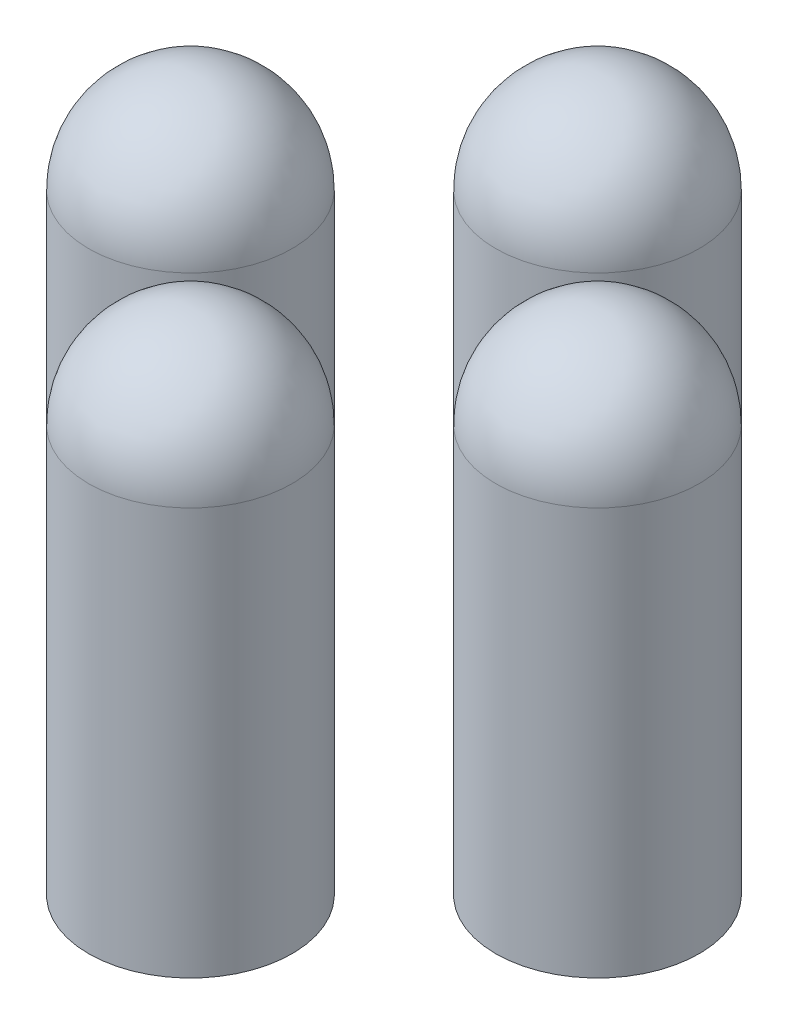
ISO-10303-21;
HEADER;
FILE_DESCRIPTION(('STEP AP214'),'2;1');
FILE_NAME('part.step','',(''),(''),'','','');
FILE_SCHEMA(('AUTOMOTIVE_DESIGN { 1 0 10303 214 1 1 1 1 }'));
ENDSEC;
DATA;
#1=APPLICATION_CONTEXT('core data for automotive mechanical design processes');
#2=APPLICATION_PROTOCOL_DEFINITION('international standard','automotive_design',2000,#1);
#3=PRODUCT_CONTEXT('',#1,'mechanical');
#4=PRODUCT('Part','Part','',(#3));
#5=PRODUCT_RELATED_PRODUCT_CATEGORY('part','',(#4));
#6=PRODUCT_DEFINITION_FORMATION('','',#4);
#7=PRODUCT_DEFINITION_CONTEXT('part definition',#1,'design');
#8=PRODUCT_DEFINITION('design','',#6,#7);
#9=PRODUCT_DEFINITION_SHAPE('','',#8);
#10=(LENGTH_UNIT() NAMED_UNIT(*) SI_UNIT(.MILLI.,.METRE.));
#11=(NAMED_UNIT(*) PLANE_ANGLE_UNIT() SI_UNIT($,.RADIAN.));
#12=(NAMED_UNIT(*) SI_UNIT($,.STERADIAN.) SOLID_ANGLE_UNIT());
#13=UNCERTAINTY_MEASURE_WITH_UNIT(LENGTH_MEASURE(1.E-05),#10,'distance_accuracy_value','');
#14=(GEOMETRIC_REPRESENTATION_CONTEXT(3) GLOBAL_UNCERTAINTY_ASSIGNED_CONTEXT((#13)) GLOBAL_UNIT_ASSIGNED_CONTEXT((#10,
#11,#12)) REPRESENTATION_CONTEXT('',''));
#15=CARTESIAN_POINT('',(0.,0.,0.));
#16=DIRECTION('',(0.,0.,1.));
#17=DIRECTION('',(1.,0.,0.));
#18=AXIS2_PLACEMENT_3D('',#15,#16,#17);
#19=CARTESIAN_POINT('',(9.9999999999999,20.,10.));
#20=DIRECTION('',(0.,-1.,0.));
#21=DIRECTION('',(0.,0.,-1.));
#22=AXIS2_PLACEMENT_3D('',#19,#20,#21);
#23=CYLINDRICAL_SURFACE('',#22,5.);
#24=CARTESIAN_POINT('',(9.9999999999999,20.,10.));
#25=DIRECTION('',(0.,1.,0.));
#26=DIRECTION('',(0.,0.,1.));
#27=AXIS2_PLACEMENT_3D('',#24,#25,#26);
#28=CIRCLE('',#27,5.);
#29=CARTESIAN_POINT('',(9.9999999999999,20.,15.));
#30=VERTEX_POINT('',#29);
#31=EDGE_CURVE('E11',#30,#30,#28,.T.);
#32=ORIENTED_EDGE('',*,*,#31,.F.);
#33=EDGE_LOOP('',(#32));
#34=FACE_BOUND('',#33,.T.);
#35=CARTESIAN_POINT('',(9.9999999999999,0.,10.));
#36=DIRECTION('',(0.,1.,0.));
#37=DIRECTION('',(0.,0.,1.));
#38=AXIS2_PLACEMENT_3D('',#35,#36,#37);
#39=CIRCLE('',#38,5.);
#40=CARTESIAN_POINT('',(9.9999999999999,0.,15.));
#41=VERTEX_POINT('',#40);
#42=EDGE_CURVE('E47',#41,#41,#39,.T.);
#43=ORIENTED_EDGE('',*,*,#42,.T.);
#44=EDGE_LOOP('',(#43));
#45=FACE_BOUND('',#44,.T.);
#46=ADVANCED_FACE('F40',(#34,#45),#23,.T.);
#47=CARTESIAN_POINT('',(9.9999999999999,20.,10.));
#48=DIRECTION('',(0.,0.,1.));
#49=DIRECTION('',(1.,0.,0.));
#50=AXIS2_PLACEMENT_3D('',#47,#48,#49);
#51=SPHERICAL_SURFACE('',#50,5.);
#52=CARTESIAN_POINT('',(9.9999999999999,20.,10.));
#53=DIRECTION('',(0.,1.,0.));
#54=DIRECTION('',(0.,0.,1.));
#55=AXIS2_PLACEMENT_3D('',#52,#53,#54);
#56=SPHERICAL_SURFACE('',#55,5.);
#57=ORIENTED_EDGE('',*,*,#31,.T.);
#58=EDGE_LOOP('',(#57));
#59=FACE_BOUND('',#58,.T.);
#60=ADVANCED_FACE('F42',(#59),#56,.T.);
#61=CARTESIAN_POINT('',(9.9999999999999,0.,10.));
#62=DIRECTION('',(0.,1.,0.));
#63=DIRECTION('',(0.,0.,1.));
#64=AXIS2_PLACEMENT_3D('',#61,#62,#63);
#65=PLANE('',#64);
#66=ORIENTED_EDGE('',*,*,#42,.F.);
#67=EDGE_LOOP('',(#66));
#68=FACE_BOUND('',#67,.T.);
#69=ADVANCED_FACE('F54',(#68),#65,.F.);
#70=CLOSED_SHELL('',(#46,#60,#69));
#71=MANIFOLD_SOLID_BREP('B2',#70);
#72=CARTESIAN_POINT('',(20.,20.,0.));
#73=DIRECTION('',(0.,-1.,0.));
#74=DIRECTION('',(0.,0.,-1.));
#75=AXIS2_PLACEMENT_3D('',#72,#73,#74);
#76=CYLINDRICAL_SURFACE('',#75,5.);
#77=CARTESIAN_POINT('',(20.,20.,0.));
#78=DIRECTION('',(0.,1.,0.));
#79=DIRECTION('',(0.,0.,1.));
#80=AXIS2_PLACEMENT_3D('',#77,#78,#79);
#81=CIRCLE('',#80,5.);
#82=CARTESIAN_POINT('',(20.,20.,5.00000000000007));
#83=VERTEX_POINT('',#82);
#84=EDGE_CURVE('E39',#83,#83,#81,.T.);
#85=ORIENTED_EDGE('',*,*,#84,.F.);
#86=EDGE_LOOP('',(#85));
#87=FACE_BOUND('',#86,.T.);
#88=CARTESIAN_POINT('',(20.,0.,0.));
#89=DIRECTION('',(0.,1.,0.));
#90=DIRECTION('',(0.,0.,1.));
#91=AXIS2_PLACEMENT_3D('',#88,#89,#90);
#92=CIRCLE('',#91,5.);
#93=CARTESIAN_POINT('',(20.,0.,5.00000000000007));
#94=VERTEX_POINT('',#93);
#95=EDGE_CURVE('E96',#94,#94,#92,.T.);
#96=ORIENTED_EDGE('',*,*,#95,.T.);
#97=EDGE_LOOP('',(#96));
#98=FACE_BOUND('',#97,.T.);
#99=ADVANCED_FACE('F89',(#87,#98),#76,.T.);
#100=CARTESIAN_POINT('',(20.,20.,0.));
#101=DIRECTION('',(0.,0.,1.));
#102=DIRECTION('',(1.,0.,0.));
#103=AXIS2_PLACEMENT_3D('',#100,#101,#102);
#104=SPHERICAL_SURFACE('',#103,5.);
#105=CARTESIAN_POINT('',(20.,20.,0.));
#106=DIRECTION('',(0.,1.,0.));
#107=DIRECTION('',(0.,0.,1.));
#108=AXIS2_PLACEMENT_3D('',#105,#106,#107);
#109=SPHERICAL_SURFACE('',#108,5.);
#110=ORIENTED_EDGE('',*,*,#84,.T.);
#111=EDGE_LOOP('',(#110));
#112=FACE_BOUND('',#111,.T.);
#113=ADVANCED_FACE('F91',(#112),#109,.T.);
#114=CARTESIAN_POINT('',(20.,0.,0.));
#115=DIRECTION('',(0.,1.,0.));
#116=DIRECTION('',(0.,0.,1.));
#117=AXIS2_PLACEMENT_3D('',#114,#115,#116);
#118=PLANE('',#117);
#119=ORIENTED_EDGE('',*,*,#95,.F.);
#120=EDGE_LOOP('',(#119));
#121=FACE_BOUND('',#120,.T.);
#122=ADVANCED_FACE('F103',(#121),#118,.F.);
#123=CLOSED_SHELL('',(#99,#113,#122));
#124=MANIFOLD_SOLID_BREP('B6',#123);
#125=CARTESIAN_POINT('',(10.,20.,-10.));
#126=DIRECTION('',(0.,-1.,0.));
#127=DIRECTION('',(0.,0.,-1.));
#128=AXIS2_PLACEMENT_3D('',#125,#126,#127);
#129=CYLINDRICAL_SURFACE('',#128,5.);
#130=CARTESIAN_POINT('',(10.,20.,-10.));
#131=DIRECTION('',(0.,1.,0.));
#132=DIRECTION('',(0.,0.,1.));
#133=AXIS2_PLACEMENT_3D('',#130,#131,#132);
#134=CIRCLE('',#133,5.);
#135=CARTESIAN_POINT('',(10.,20.,-5.));
#136=VERTEX_POINT('',#135);
#137=EDGE_CURVE('E88',#136,#136,#134,.T.);
#138=ORIENTED_EDGE('',*,*,#137,.F.);
#139=EDGE_LOOP('',(#138));
#140=FACE_BOUND('',#139,.T.);
#141=CARTESIAN_POINT('',(10.,0.,-10.));
#142=DIRECTION('',(0.,1.,0.));
#143=DIRECTION('',(0.,0.,1.));
#144=AXIS2_PLACEMENT_3D('',#141,#142,#143);
#145=CIRCLE('',#144,5.);
#146=CARTESIAN_POINT('',(10.,0.,-5.));
#147=VERTEX_POINT('',#146);
#148=EDGE_CURVE('E144',#147,#147,#145,.T.);
#149=ORIENTED_EDGE('',*,*,#148,.T.);
#150=EDGE_LOOP('',(#149));
#151=FACE_BOUND('',#150,.T.);
#152=ADVANCED_FACE('F137',(#140,#151),#129,.T.);
#153=CARTESIAN_POINT('',(10.,20.,-10.));
#154=DIRECTION('',(0.,0.,1.));
#155=DIRECTION('',(1.,0.,0.));
#156=AXIS2_PLACEMENT_3D('',#153,#154,#155);
#157=SPHERICAL_SURFACE('',#156,5.);
#158=CARTESIAN_POINT('',(10.,20.,-10.));
#159=DIRECTION('',(0.,1.,0.));
#160=DIRECTION('',(0.,0.,1.));
#161=AXIS2_PLACEMENT_3D('',#158,#159,#160);
#162=SPHERICAL_SURFACE('',#161,5.);
#163=ORIENTED_EDGE('',*,*,#137,.T.);
#164=EDGE_LOOP('',(#163));
#165=FACE_BOUND('',#164,.T.);
#166=ADVANCED_FACE('F139',(#165),#162,.T.);
#167=CARTESIAN_POINT('',(10.,0.,-10.));
#168=DIRECTION('',(0.,1.,0.));
#169=DIRECTION('',(0.,0.,1.));
#170=AXIS2_PLACEMENT_3D('',#167,#168,#169);
#171=PLANE('',#170);
#172=ORIENTED_EDGE('',*,*,#148,.F.);
#173=EDGE_LOOP('',(#172));
#174=FACE_BOUND('',#173,.T.);
#175=ADVANCED_FACE('F151',(#174),#171,.F.);
#176=CLOSED_SHELL('',(#152,#166,#175));
#177=MANIFOLD_SOLID_BREP('B34',#176);
#178=CARTESIAN_POINT('',(0.,20.,0.));
#179=DIRECTION('',(0.,-1.,0.));
#180=DIRECTION('',(0.,0.,-1.));
#181=AXIS2_PLACEMENT_3D('',#178,#179,#180);
#182=CYLINDRICAL_SURFACE('',#181,5.);
#183=CARTESIAN_POINT('',(0.,20.,0.));
#184=DIRECTION('',(0.,1.,0.));
#185=DIRECTION('',(0.,0.,1.));
#186=AXIS2_PLACEMENT_3D('',#183,#184,#185);
#187=CIRCLE('',#186,5.);
#188=CARTESIAN_POINT('',(0.,20.,5.));
#189=VERTEX_POINT('',#188);
#190=EDGE_CURVE('E136',#189,#189,#187,.T.);
#191=ORIENTED_EDGE('',*,*,#190,.F.);
#192=EDGE_LOOP('',(#191));
#193=FACE_BOUND('',#192,.T.);
#194=CARTESIAN_POINT('',(0.,0.,0.));
#195=DIRECTION('',(0.,1.,0.));
#196=DIRECTION('',(0.,0.,1.));
#197=AXIS2_PLACEMENT_3D('',#194,#195,#196);
#198=CIRCLE('',#197,5.);
#199=CARTESIAN_POINT('',(0.,0.,5.));
#200=VERTEX_POINT('',#199);
#201=EDGE_CURVE('E185',#200,#200,#198,.T.);
#202=ORIENTED_EDGE('',*,*,#201,.T.);
#203=EDGE_LOOP('',(#202));
#204=FACE_BOUND('',#203,.T.);
#205=ADVANCED_FACE('F178',(#193,#204),#182,.T.);
#206=CARTESIAN_POINT('',(0.,20.,0.));
#207=DIRECTION('',(0.,0.,1.));
#208=DIRECTION('',(1.,0.,0.));
#209=AXIS2_PLACEMENT_3D('',#206,#207,#208);
#210=SPHERICAL_SURFACE('',#209,5.);
#211=CARTESIAN_POINT('',(0.,20.,0.));
#212=DIRECTION('',(0.,1.,0.));
#213=DIRECTION('',(0.,0.,1.));
#214=AXIS2_PLACEMENT_3D('',#211,#212,#213);
#215=SPHERICAL_SURFACE('',#214,5.);
#216=ORIENTED_EDGE('',*,*,#190,.T.);
#217=EDGE_LOOP('',(#216));
#218=FACE_BOUND('',#217,.T.);
#219=ADVANCED_FACE('F180',(#218),#215,.T.);
#220=CARTESIAN_POINT('',(0.,0.,0.));
#221=DIRECTION('',(0.,1.,0.));
#222=DIRECTION('',(0.,0.,1.));
#223=AXIS2_PLACEMENT_3D('',#220,#221,#222);
#224=PLANE('',#223);
#225=ORIENTED_EDGE('',*,*,#201,.F.);
#226=EDGE_LOOP('',(#225));
#227=FACE_BOUND('',#226,.T.);
#228=ADVANCED_FACE('F192',(#227),#224,.F.);
#229=CLOSED_SHELL('',(#205,#219,#228));
#230=MANIFOLD_SOLID_BREP('B83',#229);
#231=ADVANCED_BREP_SHAPE_REPRESENTATION('',(#18,#71,#124,#177,#230),#14);
#232=SHAPE_DEFINITION_REPRESENTATION(#9,#231);
ENDSEC;
END-ISO-10303-21;
